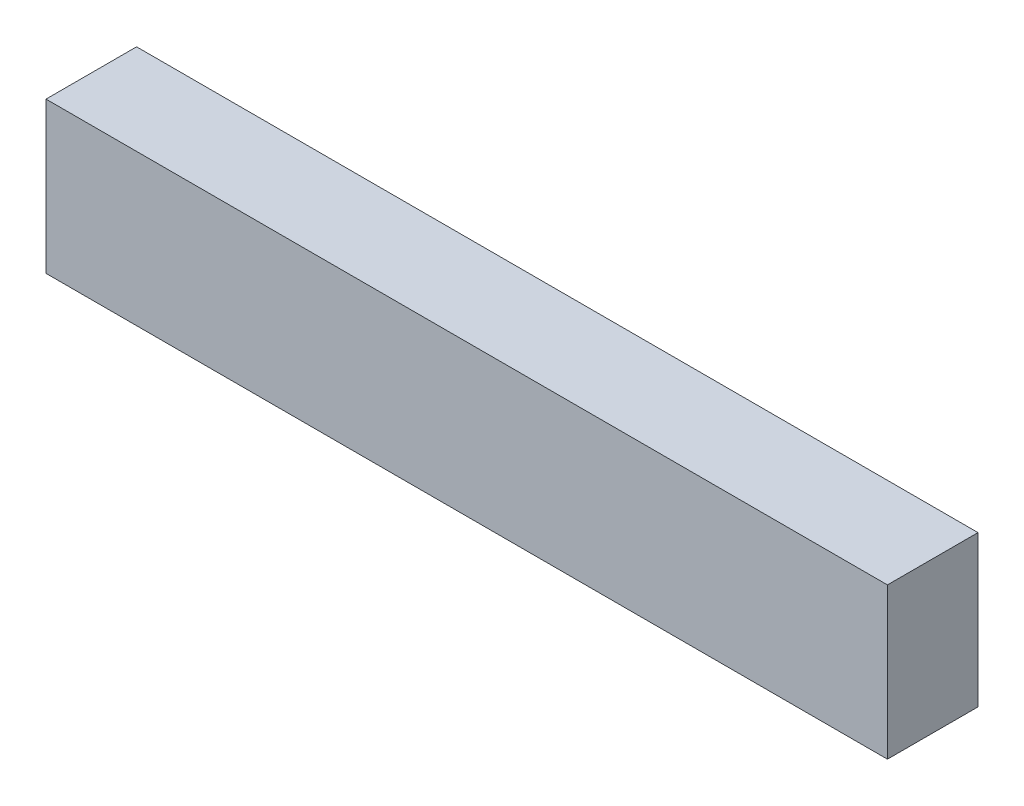
ISO-10303-21;
HEADER;
FILE_DESCRIPTION(('STEP AP214'),'2;1');
FILE_NAME('part.step','',(''),(''),'','','');
FILE_SCHEMA(('AUTOMOTIVE_DESIGN { 1 0 10303 214 1 1 1 1 }'));
ENDSEC;
DATA;
#1=APPLICATION_CONTEXT('core data for automotive mechanical design processes');
#2=APPLICATION_PROTOCOL_DEFINITION('international standard','automotive_design',2000,#1);
#3=PRODUCT_CONTEXT('',#1,'mechanical');
#4=PRODUCT('Part','Part','',(#3));
#5=PRODUCT_RELATED_PRODUCT_CATEGORY('part','',(#4));
#6=PRODUCT_DEFINITION_FORMATION('','',#4);
#7=PRODUCT_DEFINITION_CONTEXT('part definition',#1,'design');
#8=PRODUCT_DEFINITION('design','',#6,#7);
#9=PRODUCT_DEFINITION_SHAPE('','',#8);
#10=(LENGTH_UNIT() NAMED_UNIT(*) SI_UNIT(.MILLI.,.METRE.));
#11=(NAMED_UNIT(*) PLANE_ANGLE_UNIT() SI_UNIT($,.RADIAN.));
#12=(NAMED_UNIT(*) SI_UNIT($,.STERADIAN.) SOLID_ANGLE_UNIT());
#13=UNCERTAINTY_MEASURE_WITH_UNIT(LENGTH_MEASURE(1.E-05),#10,'distance_accuracy_value','');
#14=(GEOMETRIC_REPRESENTATION_CONTEXT(3) GLOBAL_UNCERTAINTY_ASSIGNED_CONTEXT((#13)) GLOBAL_UNIT_ASSIGNED_CONTEXT((#10,
#11,#12)) REPRESENTATION_CONTEXT('',''));
#15=CARTESIAN_POINT('',(0.,0.,0.));
#16=DIRECTION('',(0.,0.,1.));
#17=DIRECTION('',(1.,0.,0.));
#18=AXIS2_PLACEMENT_3D('',#15,#16,#17);
#19=CARTESIAN_POINT('',(63.5000000000001,127.,38.1));
#20=DIRECTION('',(1.,0.,0.));
#21=DIRECTION('',(0.,1.,0.));
#22=AXIS2_PLACEMENT_3D('',#19,#20,#21);
#23=PLANE('',#22);
#24=DIRECTION('',(0.,-1.,0.));
#25=VECTOR('',#24,1.);
#26=CARTESIAN_POINT('',(63.5000000000001,127.,0.));
#27=LINE('',#26,#25);
#28=CARTESIAN_POINT('',(63.5000000000001,127.,0.));
#29=VERTEX_POINT('',#28);
#30=CARTESIAN_POINT('',(63.5000000000001,63.5,0.));
#31=VERTEX_POINT('',#30);
#32=EDGE_CURVE('E100',#29,#31,#27,.T.);
#33=ORIENTED_EDGE('',*,*,#32,.T.);
#34=DIRECTION('',(0.,0.,-1.));
#35=VECTOR('',#34,1.);
#36=CARTESIAN_POINT('',(63.5000000000001,63.5,38.1));
#37=LINE('',#36,#35);
#38=CARTESIAN_POINT('',(63.5000000000001,63.5,38.1));
#39=VERTEX_POINT('',#38);
#40=EDGE_CURVE('E11',#39,#31,#37,.T.);
#41=ORIENTED_EDGE('',*,*,#40,.F.);
#42=DIRECTION('',(0.,-1.,0.));
#43=VECTOR('',#42,1.);
#44=CARTESIAN_POINT('',(63.5000000000001,127.,38.1));
#45=LINE('',#44,#43);
#46=CARTESIAN_POINT('',(63.5000000000001,127.,38.1));
#47=VERTEX_POINT('',#46);
#48=EDGE_CURVE('E88',#47,#39,#45,.T.);
#49=ORIENTED_EDGE('',*,*,#48,.F.);
#50=DIRECTION('',(0.,0.,-1.));
#51=VECTOR('',#50,1.);
#52=CARTESIAN_POINT('',(63.5000000000001,127.,38.1));
#53=LINE('',#52,#51);
#54=EDGE_CURVE('E96',#47,#29,#53,.T.);
#55=ORIENTED_EDGE('',*,*,#54,.T.);
#56=EDGE_LOOP('',(#33,#41,#49,#55));
#57=FACE_BOUND('',#56,.T.);
#58=ADVANCED_FACE('F37',(#57),#23,.F.);
#59=CARTESIAN_POINT('',(63.5000000000001,63.5,38.1));
#60=DIRECTION('',(0.,1.,0.));
#61=DIRECTION('',(0.,0.,1.));
#62=AXIS2_PLACEMENT_3D('',#59,#60,#61);
#63=PLANE('',#62);
#64=DIRECTION('',(1.,0.,0.));
#65=VECTOR('',#64,1.);
#66=CARTESIAN_POINT('',(63.5000000000001,63.5,0.));
#67=LINE('',#66,#65);
#68=CARTESIAN_POINT('',(417.45,63.5,0.));
#69=VERTEX_POINT('',#68);
#70=EDGE_CURVE('E92',#31,#69,#67,.T.);
#71=ORIENTED_EDGE('',*,*,#70,.T.);
#72=DIRECTION('',(0.,0.,-1.));
#73=VECTOR('',#72,1.);
#74=CARTESIAN_POINT('',(417.45,63.5,38.1));
#75=LINE('',#74,#73);
#76=CARTESIAN_POINT('',(417.45,63.5,38.1));
#77=VERTEX_POINT('',#76);
#78=EDGE_CURVE('E45',#77,#69,#75,.T.);
#79=ORIENTED_EDGE('',*,*,#78,.F.);
#80=DIRECTION('',(1.,0.,0.));
#81=VECTOR('',#80,1.);
#82=CARTESIAN_POINT('',(63.5000000000001,63.5,38.1));
#83=LINE('',#82,#81);
#84=EDGE_CURVE('E83',#39,#77,#83,.T.);
#85=ORIENTED_EDGE('',*,*,#84,.F.);
#86=ORIENTED_EDGE('',*,*,#40,.T.);
#87=EDGE_LOOP('',(#71,#79,#85,#86));
#88=FACE_BOUND('',#87,.T.);
#89=ADVANCED_FACE('F91',(#88),#63,.F.);
#90=CARTESIAN_POINT('',(417.45,127.,38.1));
#91=DIRECTION('',(-1.,0.,0.));
#92=DIRECTION('',(0.,-1.,0.));
#93=AXIS2_PLACEMENT_3D('',#90,#91,#92);
#94=PLANE('',#93);
#95=DIRECTION('',(0.,1.,0.));
#96=VECTOR('',#95,1.);
#97=CARTESIAN_POINT('',(417.45,127.,0.));
#98=LINE('',#97,#96);
#99=CARTESIAN_POINT('',(417.45,127.,0.));
#100=VERTEX_POINT('',#99);
#101=EDGE_CURVE('E70',#69,#100,#98,.T.);
#102=ORIENTED_EDGE('',*,*,#101,.T.);
#103=DIRECTION('',(0.,0.,-1.));
#104=VECTOR('',#103,1.);
#105=CARTESIAN_POINT('',(417.45,127.,38.1));
#106=LINE('',#105,#104);
#107=CARTESIAN_POINT('',(417.45,127.,38.1));
#108=VERTEX_POINT('',#107);
#109=EDGE_CURVE('E93',#108,#100,#106,.T.);
#110=ORIENTED_EDGE('',*,*,#109,.F.);
#111=DIRECTION('',(0.,1.,0.));
#112=VECTOR('',#111,1.);
#113=CARTESIAN_POINT('',(417.45,127.,38.1));
#114=LINE('',#113,#112);
#115=EDGE_CURVE('E86',#77,#108,#114,.T.);
#116=ORIENTED_EDGE('',*,*,#115,.F.);
#117=ORIENTED_EDGE('',*,*,#78,.T.);
#118=EDGE_LOOP('',(#102,#110,#116,#117));
#119=FACE_BOUND('',#118,.T.);
#120=ADVANCED_FACE('F94',(#119),#94,.F.);
#121=CARTESIAN_POINT('',(63.5000000000001,127.,38.1));
#122=DIRECTION('',(0.,-1.,0.));
#123=DIRECTION('',(0.,0.,-1.));
#124=AXIS2_PLACEMENT_3D('',#121,#122,#123);
#125=PLANE('',#124);
#126=DIRECTION('',(-1.,0.,0.));
#127=VECTOR('',#126,1.);
#128=CARTESIAN_POINT('',(63.5000000000001,127.,0.));
#129=LINE('',#128,#127);
#130=EDGE_CURVE('E76',#100,#29,#129,.T.);
#131=ORIENTED_EDGE('',*,*,#130,.T.);
#132=ORIENTED_EDGE('',*,*,#54,.F.);
#133=DIRECTION('',(-1.,0.,0.));
#134=VECTOR('',#133,1.);
#135=CARTESIAN_POINT('',(63.5000000000001,127.,38.1));
#136=LINE('',#135,#134);
#137=EDGE_CURVE('E53',#108,#47,#136,.T.);
#138=ORIENTED_EDGE('',*,*,#137,.F.);
#139=ORIENTED_EDGE('',*,*,#109,.T.);
#140=EDGE_LOOP('',(#131,#132,#138,#139));
#141=FACE_BOUND('',#140,.T.);
#142=ADVANCED_FACE('F107',(#141),#125,.F.);
#143=CARTESIAN_POINT('',(0.,0.,38.1));
#144=DIRECTION('',(0.,0.,1.));
#145=DIRECTION('',(1.,0.,0.));
#146=AXIS2_PLACEMENT_3D('',#143,#144,#145);
#147=PLANE('',#146);
#148=ORIENTED_EDGE('',*,*,#48,.T.);
#149=ORIENTED_EDGE('',*,*,#84,.T.);
#150=ORIENTED_EDGE('',*,*,#115,.T.);
#151=ORIENTED_EDGE('',*,*,#137,.T.);
#152=EDGE_LOOP('',(#148,#149,#150,#151));
#153=FACE_BOUND('',#152,.T.);
#154=ADVANCED_FACE('F84',(#153),#147,.T.);
#155=CARTESIAN_POINT('',(0.,0.,0.));
#156=DIRECTION('',(0.,0.,1.));
#157=DIRECTION('',(1.,0.,0.));
#158=AXIS2_PLACEMENT_3D('',#155,#156,#157);
#159=PLANE('',#158);
#160=ORIENTED_EDGE('',*,*,#32,.F.);
#161=ORIENTED_EDGE('',*,*,#130,.F.);
#162=ORIENTED_EDGE('',*,*,#101,.F.);
#163=ORIENTED_EDGE('',*,*,#70,.F.);
#164=EDGE_LOOP('',(#160,#161,#162,#163));
#165=FACE_BOUND('',#164,.T.);
#166=ADVANCED_FACE('F110',(#165),#159,.F.);
#167=CLOSED_SHELL('',(#58,#89,#120,#142,#154,#166));
#168=MANIFOLD_SOLID_BREP('B2',#167);
#169=ADVANCED_BREP_SHAPE_REPRESENTATION('',(#18,#168),#14);
#170=SHAPE_DEFINITION_REPRESENTATION(#9,#169);
ENDSEC;
END-ISO-10303-21;
